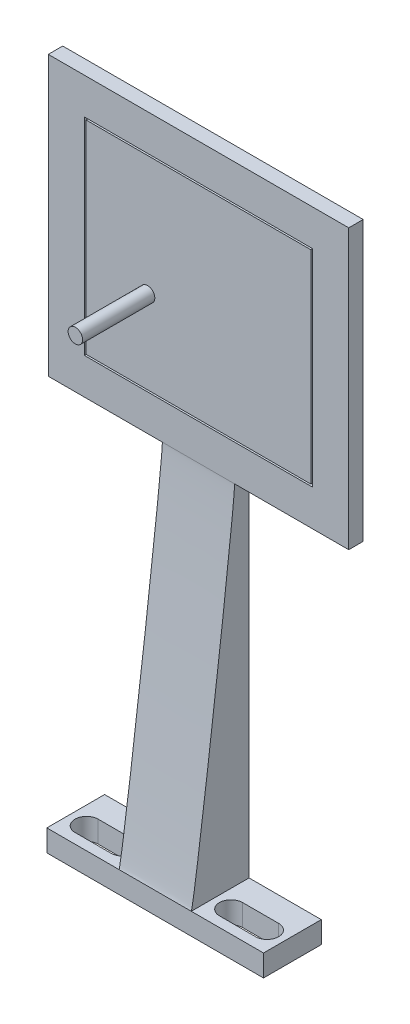
ISO-10303-21;
HEADER;
FILE_DESCRIPTION(('STEP AP214'),'2;1');
FILE_NAME('part.step','',(''),(''),'','','');
FILE_SCHEMA(('AUTOMOTIVE_DESIGN { 1 0 10303 214 1 1 1 1 }'));
ENDSEC;
DATA;
#1=APPLICATION_CONTEXT('core data for automotive mechanical design processes');
#2=APPLICATION_PROTOCOL_DEFINITION('international standard','automotive_design',2000,#1);
#3=PRODUCT_CONTEXT('',#1,'mechanical');
#4=PRODUCT('Part','Part','',(#3));
#5=PRODUCT_RELATED_PRODUCT_CATEGORY('part','',(#4));
#6=PRODUCT_DEFINITION_FORMATION('','',#4);
#7=PRODUCT_DEFINITION_CONTEXT('part definition',#1,'design');
#8=PRODUCT_DEFINITION('design','',#6,#7);
#9=PRODUCT_DEFINITION_SHAPE('','',#8);
#10=(LENGTH_UNIT() NAMED_UNIT(*) SI_UNIT(.MILLI.,.METRE.));
#11=(NAMED_UNIT(*) PLANE_ANGLE_UNIT() SI_UNIT($,.RADIAN.));
#12=(NAMED_UNIT(*) SI_UNIT($,.STERADIAN.) SOLID_ANGLE_UNIT());
#13=UNCERTAINTY_MEASURE_WITH_UNIT(LENGTH_MEASURE(1.E-05),#10,'distance_accuracy_value','');
#14=(GEOMETRIC_REPRESENTATION_CONTEXT(3) GLOBAL_UNCERTAINTY_ASSIGNED_CONTEXT((#13)) GLOBAL_UNIT_ASSIGNED_CONTEXT((#10,
#11,#12)) REPRESENTATION_CONTEXT('',''));
#15=CARTESIAN_POINT('',(0.,0.,0.));
#16=DIRECTION('',(0.,0.,1.));
#17=DIRECTION('',(1.,0.,0.));
#18=AXIS2_PLACEMENT_3D('',#15,#16,#17);
#19=CARTESIAN_POINT('',(0.,-81.6,0.));
#20=DIRECTION('',(0.,-1.,0.));
#21=DIRECTION('',(0.,0.,-1.));
#22=AXIS2_PLACEMENT_3D('',#19,#20,#21);
#23=PLANE('',#22);
#24=DIRECTION('',(-1.,0.,0.));
#25=VECTOR('',#24,1.);
#26=CARTESIAN_POINT('',(0.,-81.6,2.9));
#27=LINE('',#26,#25);
#28=CARTESIAN_POINT('',(8.05000000000001,-81.6,2.9));
#29=VERTEX_POINT('',#28);
#30=CARTESIAN_POINT('',(3.05000000000001,-81.6,2.9));
#31=VERTEX_POINT('',#30);
#32=EDGE_CURVE('E637',#29,#31,#27,.T.);
#33=ORIENTED_EDGE('',*,*,#32,.F.);
#34=CARTESIAN_POINT('',(8.05000000000001,-81.6,4.5));
#35=DIRECTION('',(0.,-1.,0.));
#36=DIRECTION('',(0.,0.,-1.));
#37=AXIS2_PLACEMENT_3D('',#34,#35,#36);
#38=CIRCLE('',#37,1.6);
#39=CARTESIAN_POINT('',(8.05000000000001,-81.6,6.1));
#40=VERTEX_POINT('',#39);
#41=EDGE_CURVE('E264',#40,#29,#38,.F.);
#42=ORIENTED_EDGE('',*,*,#41,.F.);
#43=DIRECTION('',(1.,0.,0.));
#44=VECTOR('',#43,1.);
#45=CARTESIAN_POINT('',(0.,-81.6,6.1));
#46=LINE('',#45,#44);
#47=CARTESIAN_POINT('',(3.0500000570488,-81.6,6.1));
#48=VERTEX_POINT('',#47);
#49=EDGE_CURVE('E547',#48,#40,#46,.T.);
#50=ORIENTED_EDGE('',*,*,#49,.F.);
#51=CARTESIAN_POINT('',(3.05000000000001,-81.6,4.5));
#52=DIRECTION('',(0.,-1.,0.));
#53=DIRECTION('',(0.,0.,-1.));
#54=AXIS2_PLACEMENT_3D('',#51,#52,#53);
#55=CIRCLE('',#54,1.6);
#56=EDGE_CURVE('E550',#48,#31,#55,.T.);
#57=ORIENTED_EDGE('',*,*,#56,.T.);
#58=EDGE_LOOP('',(#33,#42,#50,#57));
#59=FACE_BOUND('',#58,.T.);
#60=DIRECTION('',(1.,0.,0.));
#61=VECTOR('',#60,1.);
#62=CARTESIAN_POINT('',(0.,-81.6,7.5));
#63=LINE('',#62,#61);
#64=CARTESIAN_POINT('',(0.550000000000006,-81.6,7.5));
#65=VERTEX_POINT('',#64);
#66=CARTESIAN_POINT('',(10.55,-81.6,7.5));
#67=VERTEX_POINT('',#66);
#68=EDGE_CURVE('E335',#65,#67,#63,.T.);
#69=ORIENTED_EDGE('',*,*,#68,.T.);
#70=DIRECTION('',(0.,0.,-1.));
#71=VECTOR('',#70,1.);
#72=CARTESIAN_POINT('',(10.55,-81.6,1.5));
#73=LINE('',#72,#71);
#74=CARTESIAN_POINT('',(10.55,-81.6,-0.5));
#75=VERTEX_POINT('',#74);
#76=EDGE_CURVE('E111',#67,#75,#73,.T.);
#77=ORIENTED_EDGE('',*,*,#76,.T.);
#78=DIRECTION('',(1.,0.,0.));
#79=VECTOR('',#78,1.);
#80=CARTESIAN_POINT('',(0.,-81.6,-0.5));
#81=LINE('',#80,#79);
#82=CARTESIAN_POINT('',(0.550000000000007,-81.6,-0.5));
#83=VERTEX_POINT('',#82);
#84=EDGE_CURVE('E319',#83,#75,#81,.T.);
#85=ORIENTED_EDGE('',*,*,#84,.F.);
#86=DIRECTION('',(0.,0.,-1.));
#87=VECTOR('',#86,1.);
#88=CARTESIAN_POINT('',(0.550000000000007,-81.6,0.));
#89=LINE('',#88,#87);
#90=EDGE_CURVE('E329',#65,#83,#89,.T.);
#91=ORIENTED_EDGE('',*,*,#90,.F.);
#92=EDGE_LOOP('',(#69,#77,#85,#91));
#93=FACE_BOUND('',#92,.T.);
#94=ADVANCED_FACE('F83',(#59,#93),#23,.F.);
#95=CARTESIAN_POINT('',(0.,-33.35,-0.5));
#96=DIRECTION('',(0.,-1.,0.));
#97=DIRECTION('',(0.,0.,-1.));
#98=AXIS2_PLACEMENT_3D('',#95,#96,#97);
#99=PLANE('',#98);
#100=DIRECTION('',(0.,0.,-1.));
#101=VECTOR('',#100,1.);
#102=CARTESIAN_POINT('',(10.55,-33.35,1.5));
#103=LINE('',#102,#101);
#104=CARTESIAN_POINT('',(10.55,-33.35,1.5));
#105=VERTEX_POINT('',#104);
#106=CARTESIAN_POINT('',(10.55,-33.35,-0.5));
#107=VERTEX_POINT('',#106);
#108=EDGE_CURVE('E401',#105,#107,#103,.T.);
#109=ORIENTED_EDGE('',*,*,#108,.F.);
#110=DIRECTION('',(1.,0.,0.));
#111=VECTOR('',#110,1.);
#112=CARTESIAN_POINT('',(0.,-33.35,1.5));
#113=LINE('',#112,#111);
#114=CARTESIAN_POINT('',(-5.25,-33.35,1.5));
#115=VERTEX_POINT('',#114);
#116=EDGE_CURVE('E385',#115,#105,#113,.T.);
#117=ORIENTED_EDGE('',*,*,#116,.F.);
#118=DIRECTION('',(0.,0.,1.));
#119=VECTOR('',#118,1.);
#120=CARTESIAN_POINT('',(-5.25,-33.35,-0.5));
#121=LINE('',#120,#119);
#122=CARTESIAN_POINT('',(-5.25,-33.35,-0.5));
#123=VERTEX_POINT('',#122);
#124=EDGE_CURVE('E348',#123,#115,#121,.T.);
#125=ORIENTED_EDGE('',*,*,#124,.F.);
#126=DIRECTION('',(1.,0.,0.));
#127=VECTOR('',#126,1.);
#128=CARTESIAN_POINT('',(0.,-33.35,-0.5));
#129=LINE('',#128,#127);
#130=EDGE_CURVE('E503',#123,#107,#129,.T.);
#131=ORIENTED_EDGE('',*,*,#130,.T.);
#132=EDGE_LOOP('',(#109,#117,#125,#131));
#133=FACE_BOUND('',#132,.T.);
#134=ADVANCED_FACE('F539',(#133),#99,.T.);
#135=CARTESIAN_POINT('',(0.,0.25,-0.5));
#136=DIRECTION('',(0.,-1.,0.));
#137=DIRECTION('',(0.,0.,-1.));
#138=AXIS2_PLACEMENT_3D('',#135,#136,#137);
#139=PLANE('',#138);
#140=DIRECTION('',(1.,0.,0.));
#141=VECTOR('',#140,1.);
#142=CARTESIAN_POINT('',(0.,0.25,1.5));
#143=LINE('',#142,#141);
#144=CARTESIAN_POINT('',(-0.25,0.25,1.5));
#145=VERTEX_POINT('',#144);
#146=CARTESIAN_POINT('',(31.35,0.25,1.5));
#147=VERTEX_POINT('',#146);
#148=EDGE_CURVE('E381',#145,#147,#143,.T.);
#149=ORIENTED_EDGE('',*,*,#148,.F.);
#150=DIRECTION('',(0.,0.,1.));
#151=VECTOR('',#150,1.);
#152=CARTESIAN_POINT('',(-0.25,0.25,-0.5));
#153=LINE('',#152,#151);
#154=CARTESIAN_POINT('',(-0.25,0.25,-0.5));
#155=VERTEX_POINT('',#154);
#156=EDGE_CURVE('E365',#155,#145,#153,.T.);
#157=ORIENTED_EDGE('',*,*,#156,.F.);
#158=DIRECTION('',(1.,0.,0.));
#159=VECTOR('',#158,1.);
#160=CARTESIAN_POINT('',(0.,0.25,-0.5));
#161=LINE('',#160,#159);
#162=CARTESIAN_POINT('',(31.35,0.25,-0.5));
#163=VERTEX_POINT('',#162);
#164=EDGE_CURVE('E506',#155,#163,#161,.T.);
#165=ORIENTED_EDGE('',*,*,#164,.T.);
#166=DIRECTION('',(0.,0.,1.));
#167=VECTOR('',#166,1.);
#168=CARTESIAN_POINT('',(31.35,0.25,-0.5));
#169=LINE('',#168,#167);
#170=EDGE_CURVE('E355',#163,#147,#169,.T.);
#171=ORIENTED_EDGE('',*,*,#170,.T.);
#172=EDGE_LOOP('',(#149,#157,#165,#171));
#173=FACE_BOUND('',#172,.T.);
#174=ADVANCED_FACE('F714',(#173),#139,.T.);
#175=CARTESIAN_POINT('',(-0.25,0.,-0.5));
#176=DIRECTION('',(-1.,0.,0.));
#177=DIRECTION('',(0.,-1.,0.));
#178=AXIS2_PLACEMENT_3D('',#175,#176,#177);
#179=PLANE('',#178);
#180=DIRECTION('',(0.,-1.,0.));
#181=VECTOR('',#180,1.);
#182=CARTESIAN_POINT('',(-0.25,0.,1.5));
#183=LINE('',#182,#181);
#184=CARTESIAN_POINT('',(-0.249999999999996,-28.35,1.5));
#185=VERTEX_POINT('',#184);
#186=EDGE_CURVE('E368',#145,#185,#183,.T.);
#187=ORIENTED_EDGE('',*,*,#186,.T.);
#188=DIRECTION('',(0.,0.,1.));
#189=VECTOR('',#188,1.);
#190=CARTESIAN_POINT('',(-0.249999999999996,-28.35,-0.5));
#191=LINE('',#190,#189);
#192=CARTESIAN_POINT('',(-0.249999999999996,-28.35,-0.5));
#193=VERTEX_POINT('',#192);
#194=EDGE_CURVE('E361',#193,#185,#191,.T.);
#195=ORIENTED_EDGE('',*,*,#194,.F.);
#196=DIRECTION('',(0.,-1.,0.));
#197=VECTOR('',#196,1.);
#198=CARTESIAN_POINT('',(-0.25,0.,-0.5));
#199=LINE('',#198,#197);
#200=EDGE_CURVE('E345',#155,#193,#199,.T.);
#201=ORIENTED_EDGE('',*,*,#200,.F.);
#202=ORIENTED_EDGE('',*,*,#156,.T.);
#203=EDGE_LOOP('',(#187,#195,#201,#202));
#204=FACE_BOUND('',#203,.T.);
#205=ADVANCED_FACE('F433',(#204),#179,.F.);
#206=CARTESIAN_POINT('',(0.,-28.35,-0.5));
#207=DIRECTION('',(0.,-1.,0.));
#208=DIRECTION('',(0.,0.,-1.));
#209=AXIS2_PLACEMENT_3D('',#206,#207,#208);
#210=PLANE('',#209);
#211=DIRECTION('',(1.,0.,0.));
#212=VECTOR('',#211,1.);
#213=CARTESIAN_POINT('',(0.,-28.35,1.5));
#214=LINE('',#213,#212);
#215=CARTESIAN_POINT('',(31.35,-28.35,1.5));
#216=VERTEX_POINT('',#215);
#217=EDGE_CURVE('E373',#185,#216,#214,.T.);
#218=ORIENTED_EDGE('',*,*,#217,.T.);
#219=DIRECTION('',(0.,0.,1.));
#220=VECTOR('',#219,1.);
#221=CARTESIAN_POINT('',(31.35,-28.35,-0.5));
#222=LINE('',#221,#220);
#223=CARTESIAN_POINT('',(31.35,-28.35,-0.5));
#224=VERTEX_POINT('',#223);
#225=EDGE_CURVE('E358',#224,#216,#222,.T.);
#226=ORIENTED_EDGE('',*,*,#225,.F.);
#227=DIRECTION('',(1.,0.,0.));
#228=VECTOR('',#227,1.);
#229=CARTESIAN_POINT('',(0.,-28.35,-0.5));
#230=LINE('',#229,#228);
#231=EDGE_CURVE('E513',#193,#224,#230,.T.);
#232=ORIENTED_EDGE('',*,*,#231,.F.);
#233=ORIENTED_EDGE('',*,*,#194,.T.);
#234=EDGE_LOOP('',(#218,#226,#232,#233));
#235=FACE_BOUND('',#234,.T.);
#236=ADVANCED_FACE('F833',(#235),#210,.F.);
#237=CARTESIAN_POINT('',(36.35,0.,-0.5));
#238=DIRECTION('',(-1.,0.,0.));
#239=DIRECTION('',(0.,-1.,0.));
#240=AXIS2_PLACEMENT_3D('',#237,#238,#239);
#241=PLANE('',#240);
#242=DIRECTION('',(0.,-1.,0.));
#243=VECTOR('',#242,1.);
#244=CARTESIAN_POINT('',(36.35,0.,1.5));
#245=LINE('',#244,#243);
#246=CARTESIAN_POINT('',(36.35,5.25,1.5));
#247=VERTEX_POINT('',#246);
#248=CARTESIAN_POINT('',(36.35,-33.35,1.5));
#249=VERTEX_POINT('',#248);
#250=EDGE_CURVE('E492',#247,#249,#245,.T.);
#251=ORIENTED_EDGE('',*,*,#250,.T.);
#252=DIRECTION('',(0.,0.,1.));
#253=VECTOR('',#252,1.);
#254=CARTESIAN_POINT('',(36.35,-33.35,-0.5));
#255=LINE('',#254,#253);
#256=CARTESIAN_POINT('',(36.35,-33.35,-0.5));
#257=VERTEX_POINT('',#256);
#258=EDGE_CURVE('E351',#257,#249,#255,.T.);
#259=ORIENTED_EDGE('',*,*,#258,.F.);
#260=DIRECTION('',(0.,-1.,0.));
#261=VECTOR('',#260,1.);
#262=CARTESIAN_POINT('',(36.35,0.,-0.5));
#263=LINE('',#262,#261);
#264=CARTESIAN_POINT('',(36.35,5.25,-0.5));
#265=VERTEX_POINT('',#264);
#266=EDGE_CURVE('E372',#265,#257,#263,.T.);
#267=ORIENTED_EDGE('',*,*,#266,.F.);
#268=DIRECTION('',(0.,0.,1.));
#269=VECTOR('',#268,1.);
#270=CARTESIAN_POINT('',(36.35,5.25,-0.5));
#271=LINE('',#270,#269);
#272=EDGE_CURVE('E340',#265,#247,#271,.T.);
#273=ORIENTED_EDGE('',*,*,#272,.T.);
#274=EDGE_LOOP('',(#251,#259,#267,#273));
#275=FACE_BOUND('',#274,.T.);
#276=ADVANCED_FACE('F652',(#275),#241,.F.);
#277=DIRECTION('',(0.,0.,1.));
#278=VECTOR('',#277,1.);
#279=CARTESIAN_POINT('',(20.55,-33.35,1.5));
#280=LINE('',#279,#278);
#281=CARTESIAN_POINT('',(20.55,-33.35,-0.5));
#282=VERTEX_POINT('',#281);
#283=CARTESIAN_POINT('',(20.55,-33.35,1.5));
#284=VERTEX_POINT('',#283);
#285=EDGE_CURVE('E397',#282,#284,#280,.T.);
#286=ORIENTED_EDGE('',*,*,#285,.F.);
#287=EDGE_CURVE('E502',#282,#257,#129,.T.);
#288=ORIENTED_EDGE('',*,*,#287,.T.);
#289=ORIENTED_EDGE('',*,*,#258,.T.);
#290=EDGE_CURVE('E394',#284,#249,#113,.T.);
#291=ORIENTED_EDGE('',*,*,#290,.F.);
#292=EDGE_LOOP('',(#286,#288,#289,#291));
#293=FACE_BOUND('',#292,.T.);
#294=ADVANCED_FACE('F645',(#293),#99,.T.);
#295=CARTESIAN_POINT('',(-5.25,0.,-0.5));
#296=DIRECTION('',(-1.,0.,0.));
#297=DIRECTION('',(0.,-1.,0.));
#298=AXIS2_PLACEMENT_3D('',#295,#296,#297);
#299=PLANE('',#298);
#300=DIRECTION('',(0.,-1.,0.));
#301=VECTOR('',#300,1.);
#302=CARTESIAN_POINT('',(-5.25,0.,1.5));
#303=LINE('',#302,#301);
#304=CARTESIAN_POINT('',(-5.25,5.25,1.5));
#305=VERTEX_POINT('',#304);
#306=EDGE_CURVE('E388',#305,#115,#303,.T.);
#307=ORIENTED_EDGE('',*,*,#306,.F.);
#308=DIRECTION('',(0.,0.,1.));
#309=VECTOR('',#308,1.);
#310=CARTESIAN_POINT('',(-5.25,5.25,-0.5));
#311=LINE('',#310,#309);
#312=CARTESIAN_POINT('',(-5.25,5.25,-0.5));
#313=VERTEX_POINT('',#312);
#314=EDGE_CURVE('E344',#313,#305,#311,.T.);
#315=ORIENTED_EDGE('',*,*,#314,.F.);
#316=DIRECTION('',(0.,-1.,0.));
#317=VECTOR('',#316,1.);
#318=CARTESIAN_POINT('',(-5.25,0.,-0.5));
#319=LINE('',#318,#317);
#320=EDGE_CURVE('E498',#313,#123,#319,.T.);
#321=ORIENTED_EDGE('',*,*,#320,.T.);
#322=ORIENTED_EDGE('',*,*,#124,.T.);
#323=EDGE_LOOP('',(#307,#315,#321,#322));
#324=FACE_BOUND('',#323,.T.);
#325=ADVANCED_FACE('F814',(#324),#299,.T.);
#326=CARTESIAN_POINT('',(0.,5.25,-0.5));
#327=DIRECTION('',(0.,-1.,0.));
#328=DIRECTION('',(0.,0.,-1.));
#329=AXIS2_PLACEMENT_3D('',#326,#327,#328);
#330=PLANE('',#329);
#331=DIRECTION('',(1.,0.,0.));
#332=VECTOR('',#331,1.);
#333=CARTESIAN_POINT('',(0.,5.25,1.5));
#334=LINE('',#333,#332);
#335=EDGE_CURVE('E521',#305,#247,#334,.T.);
#336=ORIENTED_EDGE('',*,*,#335,.T.);
#337=ORIENTED_EDGE('',*,*,#272,.F.);
#338=DIRECTION('',(1.,0.,0.));
#339=VECTOR('',#338,1.);
#340=CARTESIAN_POINT('',(0.,5.25,-0.5));
#341=LINE('',#340,#339);
#342=EDGE_CURVE('E495',#313,#265,#341,.T.);
#343=ORIENTED_EDGE('',*,*,#342,.F.);
#344=ORIENTED_EDGE('',*,*,#314,.T.);
#345=EDGE_LOOP('',(#336,#337,#343,#344));
#346=FACE_BOUND('',#345,.T.);
#347=ADVANCED_FACE('F803',(#346),#330,.F.);
#348=CARTESIAN_POINT('',(31.35,0.,-0.5));
#349=DIRECTION('',(-1.,0.,0.));
#350=DIRECTION('',(0.,-1.,0.));
#351=AXIS2_PLACEMENT_3D('',#348,#349,#350);
#352=PLANE('',#351);
#353=DIRECTION('',(0.,-1.,0.));
#354=VECTOR('',#353,1.);
#355=CARTESIAN_POINT('',(31.35,0.,1.5));
#356=LINE('',#355,#354);
#357=EDGE_CURVE('E377',#147,#216,#356,.T.);
#358=ORIENTED_EDGE('',*,*,#357,.F.);
#359=ORIENTED_EDGE('',*,*,#170,.F.);
#360=DIRECTION('',(0.,-1.,0.));
#361=VECTOR('',#360,1.);
#362=CARTESIAN_POINT('',(31.35,0.,-0.5));
#363=LINE('',#362,#361);
#364=EDGE_CURVE('E510',#163,#224,#363,.T.);
#365=ORIENTED_EDGE('',*,*,#364,.T.);
#366=ORIENTED_EDGE('',*,*,#225,.T.);
#367=EDGE_LOOP('',(#358,#359,#365,#366));
#368=FACE_BOUND('',#367,.T.);
#369=ADVANCED_FACE('F428',(#368),#352,.T.);
#370=CARTESIAN_POINT('',(0.,0.,-0.5));
#371=DIRECTION('',(0.,0.,1.));
#372=DIRECTION('',(1.,0.,0.));
#373=AXIS2_PLACEMENT_3D('',#370,#371,#372);
#374=PLANE('',#373);
#375=ORIENTED_EDGE('',*,*,#266,.T.);
#376=ORIENTED_EDGE('',*,*,#287,.F.);
#377=DIRECTION('',(0.,1.,0.));
#378=VECTOR('',#377,1.);
#379=CARTESIAN_POINT('',(20.55,-81.6,-0.5));
#380=LINE('',#379,#378);
#381=CARTESIAN_POINT('',(20.55,-81.6,-0.5));
#382=VERTEX_POINT('',#381);
#383=EDGE_CURVE('E484',#382,#282,#380,.T.);
#384=ORIENTED_EDGE('',*,*,#383,.F.);
#385=CARTESIAN_POINT('',(30.55,-81.6,-0.5));
#386=VERTEX_POINT('',#385);
#387=EDGE_CURVE('E271',#382,#386,#81,.T.);
#388=ORIENTED_EDGE('',*,*,#387,.T.);
#389=DIRECTION('',(0.,1.,0.));
#390=VECTOR('',#389,1.);
#391=CARTESIAN_POINT('',(30.55,-84.6,-0.5));
#392=LINE('',#391,#390);
#393=CARTESIAN_POINT('',(30.55,-84.6,-0.5));
#394=VERTEX_POINT('',#393);
#395=EDGE_CURVE('E267',#394,#386,#392,.T.);
#396=ORIENTED_EDGE('',*,*,#395,.F.);
#397=DIRECTION('',(1.,0.,0.));
#398=VECTOR('',#397,1.);
#399=CARTESIAN_POINT('',(0.,-84.6,-0.5));
#400=LINE('',#399,#398);
#401=CARTESIAN_POINT('',(0.550000000000007,-84.6,-0.5));
#402=VERTEX_POINT('',#401);
#403=EDGE_CURVE('E250',#402,#394,#400,.T.);
#404=ORIENTED_EDGE('',*,*,#403,.F.);
#405=DIRECTION('',(0.,1.,0.));
#406=VECTOR('',#405,1.);
#407=CARTESIAN_POINT('',(0.550000000000007,-84.6,-0.5));
#408=LINE('',#407,#406);
#409=EDGE_CURVE('E318',#402,#83,#408,.T.);
#410=ORIENTED_EDGE('',*,*,#409,.T.);
#411=ORIENTED_EDGE('',*,*,#84,.T.);
#412=DIRECTION('',(0.,1.,0.));
#413=VECTOR('',#412,1.);
#414=CARTESIAN_POINT('',(10.55,-81.6,-0.5));
#415=LINE('',#414,#413);
#416=EDGE_CURVE('E488',#75,#107,#415,.T.);
#417=ORIENTED_EDGE('',*,*,#416,.T.);
#418=ORIENTED_EDGE('',*,*,#130,.F.);
#419=ORIENTED_EDGE('',*,*,#320,.F.);
#420=ORIENTED_EDGE('',*,*,#342,.T.);
#421=EDGE_LOOP('',(#375,#376,#384,#388,#396,#404,#410,#411,#417,#418,#419,#420));
#422=FACE_BOUND('',#421,.T.);
#423=ORIENTED_EDGE('',*,*,#164,.F.);
#424=ORIENTED_EDGE('',*,*,#200,.T.);
#425=ORIENTED_EDGE('',*,*,#231,.T.);
#426=ORIENTED_EDGE('',*,*,#364,.F.);
#427=EDGE_LOOP('',(#423,#424,#425,#426));
#428=FACE_BOUND('',#427,.T.);
#429=ADVANCED_FACE('F269',(#422,#428),#374,.F.);
#430=CARTESIAN_POINT('',(0.,0.,1.5));
#431=DIRECTION('',(0.,0.,1.));
#432=DIRECTION('',(1.,0.,0.));
#433=AXIS2_PLACEMENT_3D('',#430,#431,#432);
#434=PLANE('',#433);
#435=ORIENTED_EDGE('',*,*,#116,.T.);
#436=CARTESIAN_POINT('',(21.05,-33.35,1.5));
#437=CARTESIAN_POINT('',(17.3833333333333,-33.35,1.5));
#438=CARTESIAN_POINT('',(13.7166666666667,-33.35,1.5));
#439=CARTESIAN_POINT('',(10.05,-33.35,1.5));
#440=(BOUNDED_CURVE() B_SPLINE_CURVE(3,(#436,#437,#438,#439),.UNSPECIFIED.,.F.,
.F.) B_SPLINE_CURVE_WITH_KNOTS((4,4),(-0.02105,-0.01005),
.UNSPECIFIED.) CURVE() GEOMETRIC_REPRESENTATION_ITEM() RATIONAL_B_SPLINE_CURVE((1.,1.,1.,1.)) REPRESENTATION_ITEM(''));
#441=EDGE_CURVE('E367',#105,#284,#440,.F.);
#442=ORIENTED_EDGE('',*,*,#441,.T.);
#443=ORIENTED_EDGE('',*,*,#290,.T.);
#444=ORIENTED_EDGE('',*,*,#250,.F.);
#445=ORIENTED_EDGE('',*,*,#335,.F.);
#446=ORIENTED_EDGE('',*,*,#306,.T.);
#447=EDGE_LOOP('',(#435,#442,#443,#444,#445,#446));
#448=FACE_BOUND('',#447,.T.);
#449=ORIENTED_EDGE('',*,*,#148,.T.);
#450=ORIENTED_EDGE('',*,*,#357,.T.);
#451=ORIENTED_EDGE('',*,*,#217,.F.);
#452=ORIENTED_EDGE('',*,*,#186,.F.);
#453=EDGE_LOOP('',(#449,#450,#451,#452));
#454=FACE_BOUND('',#453,.T.);
#455=ADVANCED_FACE('F423',(#448,#454),#434,.T.);
#456=CARTESIAN_POINT('',(10.55,-81.6,1.5));
#457=DIRECTION('',(1.,0.,0.));
#458=DIRECTION('',(0.,0.,-1.));
#459=AXIS2_PLACEMENT_3D('',#456,#457,#458);
#460=PLANE('',#459);
#461=ORIENTED_EDGE('',*,*,#108,.T.);
#462=ORIENTED_EDGE('',*,*,#416,.F.);
#463=ORIENTED_EDGE('',*,*,#76,.F.);
#464=CARTESIAN_POINT('',(10.55,-33.35,1.5));
#465=CARTESIAN_POINT('',(10.55,-81.6,1.5));
#466=CARTESIAN_POINT('',(10.55,-81.6,7.5));
#467=(BOUNDED_CURVE() B_SPLINE_CURVE(2,(#464,#465,#466),.UNSPECIFIED.,.F.,
.F.) B_SPLINE_CURVE_WITH_KNOTS((3,3),(0.,1.),
.UNSPECIFIED.) CURVE() GEOMETRIC_REPRESENTATION_ITEM() RATIONAL_B_SPLINE_CURVE((1.,
0.0526315789473684,1.)) REPRESENTATION_ITEM(''));
#468=EDGE_CURVE('E97',#67,#105,#467,.F.);
#469=ORIENTED_EDGE('',*,*,#468,.T.);
#470=EDGE_LOOP('',(#461,#462,#463,#469));
#471=FACE_BOUND('',#470,.T.);
#472=ADVANCED_FACE('F412',(#471),#460,.F.);
#473=CARTESIAN_POINT('',(20.55,-81.6,1.5));
#474=DIRECTION('',(-1.,0.,0.));
#475=DIRECTION('',(0.,0.,1.));
#476=AXIS2_PLACEMENT_3D('',#473,#474,#475);
#477=PLANE('',#476);
#478=ORIENTED_EDGE('',*,*,#285,.T.);
#479=CARTESIAN_POINT('',(20.55,-81.6,7.5));
#480=CARTESIAN_POINT('',(20.55,-81.6,1.5));
#481=CARTESIAN_POINT('',(20.55,-33.35,1.5));
#482=(BOUNDED_CURVE() B_SPLINE_CURVE(2,(#479,#480,#481),.UNSPECIFIED.,.F.,
.F.) B_SPLINE_CURVE_WITH_KNOTS((3,3),(0.,1.),
.UNSPECIFIED.) CURVE() GEOMETRIC_REPRESENTATION_ITEM() RATIONAL_B_SPLINE_CURVE((1.,
0.0526315789473684,1.)) REPRESENTATION_ITEM(''));
#483=CARTESIAN_POINT('',(20.55,-81.6,7.5));
#484=VERTEX_POINT('',#483);
#485=EDGE_CURVE('E14',#284,#484,#482,.F.);
#486=ORIENTED_EDGE('',*,*,#485,.T.);
#487=DIRECTION('',(0.,0.,1.));
#488=VECTOR('',#487,1.);
#489=CARTESIAN_POINT('',(20.55,-81.6,1.5));
#490=LINE('',#489,#488);
#491=EDGE_CURVE('E104',#382,#484,#490,.T.);
#492=ORIENTED_EDGE('',*,*,#491,.F.);
#493=ORIENTED_EDGE('',*,*,#383,.T.);
#494=EDGE_LOOP('',(#478,#486,#492,#493));
#495=FACE_BOUND('',#494,.T.);
#496=ADVANCED_FACE('F422',(#495),#477,.F.);
#497=DIRECTION('',(-1.,0.,0.));
#498=VECTOR('',#497,1.);
#499=CARTESIAN_POINT('',(0.,-81.6,2.9));
#500=LINE('',#499,#498);
#501=CARTESIAN_POINT('',(28.05,-81.6,2.9));
#502=VERTEX_POINT('',#501);
#503=CARTESIAN_POINT('',(23.05,-81.6,2.9));
#504=VERTEX_POINT('',#503);
#505=EDGE_CURVE('E558',#502,#504,#500,.T.);
#506=ORIENTED_EDGE('',*,*,#505,.F.);
#507=CARTESIAN_POINT('',(28.05,-81.6,4.5));
#508=DIRECTION('',(0.,-1.,0.));
#509=DIRECTION('',(0.,0.,-1.));
#510=AXIS2_PLACEMENT_3D('',#507,#508,#509);
#511=CIRCLE('',#510,1.6);
#512=CARTESIAN_POINT('',(28.05,-81.6,6.1));
#513=VERTEX_POINT('',#512);
#514=EDGE_CURVE('E630',#513,#502,#511,.F.);
#515=ORIENTED_EDGE('',*,*,#514,.F.);
#516=DIRECTION('',(1.,0.,0.));
#517=VECTOR('',#516,1.);
#518=CARTESIAN_POINT('',(0.,-81.6,6.1));
#519=LINE('',#518,#517);
#520=CARTESIAN_POINT('',(23.05,-81.6,6.1));
#521=VERTEX_POINT('',#520);
#522=EDGE_CURVE('E557',#521,#513,#519,.T.);
#523=ORIENTED_EDGE('',*,*,#522,.F.);
#524=CARTESIAN_POINT('',(23.05,-81.6,4.5));
#525=DIRECTION('',(0.,-1.,0.));
#526=DIRECTION('',(0.,0.,-1.));
#527=AXIS2_PLACEMENT_3D('',#524,#525,#526);
#528=CIRCLE('',#527,1.6);
#529=EDGE_CURVE('E554',#521,#504,#528,.T.);
#530=ORIENTED_EDGE('',*,*,#529,.T.);
#531=EDGE_LOOP('',(#506,#515,#523,#530));
#532=FACE_BOUND('',#531,.T.);
#533=ORIENTED_EDGE('',*,*,#491,.T.);
#534=CARTESIAN_POINT('',(30.55,-81.6,7.5));
#535=VERTEX_POINT('',#534);
#536=EDGE_CURVE('E326',#484,#535,#63,.T.);
#537=ORIENTED_EDGE('',*,*,#536,.T.);
#538=DIRECTION('',(0.,0.,-1.));
#539=VECTOR('',#538,1.);
#540=CARTESIAN_POINT('',(30.55,-81.6,0.));
#541=LINE('',#540,#539);
#542=EDGE_CURVE('E323',#535,#386,#541,.T.);
#543=ORIENTED_EDGE('',*,*,#542,.T.);
#544=ORIENTED_EDGE('',*,*,#387,.F.);
#545=EDGE_LOOP('',(#533,#537,#543,#544));
#546=FACE_BOUND('',#545,.T.);
#547=ADVANCED_FACE('F711',(#532,#546),#23,.F.);
#548=CARTESIAN_POINT('',(0.,-84.6,2.9));
#549=DIRECTION('',(0.,0.,-1.));
#550=DIRECTION('',(-1.,0.,0.));
#551=AXIS2_PLACEMENT_3D('',#548,#549,#550);
#552=PLANE('',#551);
#553=ORIENTED_EDGE('',*,*,#32,.T.);
#554=DIRECTION('',(0.,1.,0.));
#555=VECTOR('',#554,1.);
#556=CARTESIAN_POINT('',(3.05000000000001,-84.6,2.9));
#557=LINE('',#556,#555);
#558=CARTESIAN_POINT('',(3.05000000000001,-84.6,2.9));
#559=VERTEX_POINT('',#558);
#560=EDGE_CURVE('E445',#559,#31,#557,.T.);
#561=ORIENTED_EDGE('',*,*,#560,.F.);
#562=DIRECTION('',(-1.,0.,0.));
#563=VECTOR('',#562,1.);
#564=CARTESIAN_POINT('',(0.,-84.6,2.9));
#565=LINE('',#564,#563);
#566=CARTESIAN_POINT('',(8.05000000000001,-84.6,2.9));
#567=VERTEX_POINT('',#566);
#568=EDGE_CURVE('E305',#567,#559,#565,.T.);
#569=ORIENTED_EDGE('',*,*,#568,.F.);
#570=DIRECTION('',(0.,1.,0.));
#571=VECTOR('',#570,1.);
#572=CARTESIAN_POINT('',(8.05000000000001,-84.6,2.9));
#573=LINE('',#572,#571);
#574=EDGE_CURVE('E476',#567,#29,#573,.T.);
#575=ORIENTED_EDGE('',*,*,#574,.T.);
#576=EDGE_LOOP('',(#553,#561,#569,#575));
#577=FACE_BOUND('',#576,.T.);
#578=ADVANCED_FACE('F721',(#577),#552,.F.);
#579=CARTESIAN_POINT('',(3.05000000000001,-84.6,4.5));
#580=DIRECTION('',(0.,1.,0.));
#581=DIRECTION('',(0.,0.,1.));
#582=AXIS2_PLACEMENT_3D('',#579,#580,#581);
#583=CYLINDRICAL_SURFACE('',#582,1.6);
#584=ORIENTED_EDGE('',*,*,#56,.F.);
#585=DIRECTION('',(0.,1.,0.));
#586=VECTOR('',#585,1.);
#587=CARTESIAN_POINT('',(3.0500000570488,-84.6,6.1));
#588=LINE('',#587,#586);
#589=CARTESIAN_POINT('',(3.0500000570488,-84.6,6.1));
#590=VERTEX_POINT('',#589);
#591=EDGE_CURVE('E450',#590,#48,#588,.T.);
#592=ORIENTED_EDGE('',*,*,#591,.F.);
#593=CARTESIAN_POINT('',(3.05000000000001,-84.6,4.5));
#594=DIRECTION('',(0.,-1.,0.));
#595=DIRECTION('',(0.,0.,-1.));
#596=AXIS2_PLACEMENT_3D('',#593,#594,#595);
#597=CIRCLE('',#596,1.6);
#598=EDGE_CURVE('E308',#590,#559,#597,.T.);
#599=ORIENTED_EDGE('',*,*,#598,.T.);
#600=ORIENTED_EDGE('',*,*,#560,.T.);
#601=EDGE_LOOP('',(#584,#592,#599,#600));
#602=FACE_BOUND('',#601,.T.);
#603=ADVANCED_FACE('F726',(#602),#583,.F.);
#604=CARTESIAN_POINT('',(0.,-84.6,6.1));
#605=DIRECTION('',(0.,0.,1.));
#606=DIRECTION('',(1.,0.,0.));
#607=AXIS2_PLACEMENT_3D('',#604,#605,#606);
#608=PLANE('',#607);
#609=ORIENTED_EDGE('',*,*,#49,.T.);
#610=DIRECTION('',(0.,1.,0.));
#611=VECTOR('',#610,1.);
#612=CARTESIAN_POINT('',(8.05000000000001,-84.6,6.1));
#613=LINE('',#612,#611);
#614=CARTESIAN_POINT('',(8.05000000000001,-84.6,6.1));
#615=VERTEX_POINT('',#614);
#616=EDGE_CURVE('E460',#615,#40,#613,.T.);
#617=ORIENTED_EDGE('',*,*,#616,.F.);
#618=DIRECTION('',(1.,0.,0.));
#619=VECTOR('',#618,1.);
#620=CARTESIAN_POINT('',(0.,-84.6,6.1));
#621=LINE('',#620,#619);
#622=EDGE_CURVE('E312',#590,#615,#621,.T.);
#623=ORIENTED_EDGE('',*,*,#622,.F.);
#624=ORIENTED_EDGE('',*,*,#591,.T.);
#625=EDGE_LOOP('',(#609,#617,#623,#624));
#626=FACE_BOUND('',#625,.T.);
#627=ADVANCED_FACE('F756',(#626),#608,.F.);
#628=CARTESIAN_POINT('',(0.,-84.6,2.9));
#629=DIRECTION('',(0.,0.,-1.));
#630=DIRECTION('',(-1.,0.,0.));
#631=AXIS2_PLACEMENT_3D('',#628,#629,#630);
#632=PLANE('',#631);
#633=ORIENTED_EDGE('',*,*,#505,.T.);
#634=DIRECTION('',(0.,1.,0.));
#635=VECTOR('',#634,1.);
#636=CARTESIAN_POINT('',(23.05,-84.6,2.9));
#637=LINE('',#636,#635);
#638=CARTESIAN_POINT('',(23.05,-84.6,2.9));
#639=VERTEX_POINT('',#638);
#640=EDGE_CURVE('E473',#639,#504,#637,.T.);
#641=ORIENTED_EDGE('',*,*,#640,.F.);
#642=DIRECTION('',(-1.,0.,0.));
#643=VECTOR('',#642,1.);
#644=CARTESIAN_POINT('',(0.,-84.6,2.9));
#645=LINE('',#644,#643);
#646=CARTESIAN_POINT('',(28.05,-84.6,2.9));
#647=VERTEX_POINT('',#646);
#648=EDGE_CURVE('E292',#647,#639,#645,.T.);
#649=ORIENTED_EDGE('',*,*,#648,.F.);
#650=DIRECTION('',(0.,1.,0.));
#651=VECTOR('',#650,1.);
#652=CARTESIAN_POINT('',(28.05,-84.6,2.9));
#653=LINE('',#652,#651);
#654=EDGE_CURVE('E276',#647,#502,#653,.T.);
#655=ORIENTED_EDGE('',*,*,#654,.T.);
#656=EDGE_LOOP('',(#633,#641,#649,#655));
#657=FACE_BOUND('',#656,.T.);
#658=ADVANCED_FACE('F735',(#657),#632,.F.);
#659=CARTESIAN_POINT('',(23.05,-84.6,4.5));
#660=DIRECTION('',(0.,1.,0.));
#661=DIRECTION('',(0.,0.,1.));
#662=AXIS2_PLACEMENT_3D('',#659,#660,#661);
#663=CYLINDRICAL_SURFACE('',#662,1.6);
#664=ORIENTED_EDGE('',*,*,#529,.F.);
#665=DIRECTION('',(0.,1.,0.));
#666=VECTOR('',#665,1.);
#667=CARTESIAN_POINT('',(23.05,-84.6,6.1));
#668=LINE('',#667,#666);
#669=CARTESIAN_POINT('',(23.05,-84.6,6.1));
#670=VERTEX_POINT('',#669);
#671=EDGE_CURVE('E470',#670,#521,#668,.T.);
#672=ORIENTED_EDGE('',*,*,#671,.F.);
#673=CARTESIAN_POINT('',(23.05,-84.6,4.5));
#674=DIRECTION('',(0.,-1.,0.));
#675=DIRECTION('',(0.,0.,-1.));
#676=AXIS2_PLACEMENT_3D('',#673,#674,#675);
#677=CIRCLE('',#676,1.6);
#678=EDGE_CURVE('E295',#670,#639,#677,.T.);
#679=ORIENTED_EDGE('',*,*,#678,.T.);
#680=ORIENTED_EDGE('',*,*,#640,.T.);
#681=EDGE_LOOP('',(#664,#672,#679,#680));
#682=FACE_BOUND('',#681,.T.);
#683=ADVANCED_FACE('F705',(#682),#663,.F.);
#684=CARTESIAN_POINT('',(0.,-84.6,6.1));
#685=DIRECTION('',(0.,0.,1.));
#686=DIRECTION('',(1.,0.,0.));
#687=AXIS2_PLACEMENT_3D('',#684,#685,#686);
#688=PLANE('',#687);
#689=ORIENTED_EDGE('',*,*,#522,.T.);
#690=DIRECTION('',(0.,1.,0.));
#691=VECTOR('',#690,1.);
#692=CARTESIAN_POINT('',(28.05,-84.6,6.1));
#693=LINE('',#692,#691);
#694=CARTESIAN_POINT('',(28.05,-84.6,6.1));
#695=VERTEX_POINT('',#694);
#696=EDGE_CURVE('E466',#695,#513,#693,.T.);
#697=ORIENTED_EDGE('',*,*,#696,.F.);
#698=DIRECTION('',(1.,0.,0.));
#699=VECTOR('',#698,1.);
#700=CARTESIAN_POINT('',(0.,-84.6,6.1));
#701=LINE('',#700,#699);
#702=EDGE_CURVE('E299',#670,#695,#701,.T.);
#703=ORIENTED_EDGE('',*,*,#702,.F.);
#704=ORIENTED_EDGE('',*,*,#671,.T.);
#705=EDGE_LOOP('',(#689,#697,#703,#704));
#706=FACE_BOUND('',#705,.T.);
#707=ADVANCED_FACE('F702',(#706),#688,.F.);
#708=CARTESIAN_POINT('',(30.55,-84.6,0.));
#709=DIRECTION('',(1.,0.,0.));
#710=DIRECTION('',(0.,0.,-1.));
#711=AXIS2_PLACEMENT_3D('',#708,#709,#710);
#712=PLANE('',#711);
#713=ORIENTED_EDGE('',*,*,#542,.F.);
#714=DIRECTION('',(0.,1.,0.));
#715=VECTOR('',#714,1.);
#716=CARTESIAN_POINT('',(30.55,-84.6,7.5));
#717=LINE('',#716,#715);
#718=CARTESIAN_POINT('',(30.55,-84.6,7.5));
#719=VERTEX_POINT('',#718);
#720=EDGE_CURVE('E277',#719,#535,#717,.T.);
#721=ORIENTED_EDGE('',*,*,#720,.F.);
#722=DIRECTION('',(0.,0.,-1.));
#723=VECTOR('',#722,1.);
#724=CARTESIAN_POINT('',(30.55,-84.6,0.));
#725=LINE('',#724,#723);
#726=EDGE_CURVE('E256',#719,#394,#725,.T.);
#727=ORIENTED_EDGE('',*,*,#726,.T.);
#728=ORIENTED_EDGE('',*,*,#395,.T.);
#729=EDGE_LOOP('',(#713,#721,#727,#728));
#730=FACE_BOUND('',#729,.T.);
#731=ADVANCED_FACE('F279',(#730),#712,.T.);
#732=CARTESIAN_POINT('',(0.,-84.6,7.5));
#733=DIRECTION('',(0.,0.,1.));
#734=DIRECTION('',(1.,0.,0.));
#735=AXIS2_PLACEMENT_3D('',#732,#733,#734);
#736=PLANE('',#735);
#737=ORIENTED_EDGE('',*,*,#68,.F.);
#738=DIRECTION('',(0.,1.,0.));
#739=VECTOR('',#738,1.);
#740=CARTESIAN_POINT('',(0.550000000000006,-84.6,7.5));
#741=LINE('',#740,#739);
#742=CARTESIAN_POINT('',(0.550000000000006,-84.6,7.5));
#743=VERTEX_POINT('',#742);
#744=EDGE_CURVE('E479',#743,#65,#741,.T.);
#745=ORIENTED_EDGE('',*,*,#744,.F.);
#746=DIRECTION('',(1.,0.,0.));
#747=VECTOR('',#746,1.);
#748=CARTESIAN_POINT('',(0.,-84.6,7.5));
#749=LINE('',#748,#747);
#750=EDGE_CURVE('E282',#743,#719,#749,.T.);
#751=ORIENTED_EDGE('',*,*,#750,.T.);
#752=ORIENTED_EDGE('',*,*,#720,.T.);
#753=ORIENTED_EDGE('',*,*,#536,.F.);
#754=CARTESIAN_POINT('',(10.05,-81.6,7.5));
#755=CARTESIAN_POINT('',(13.7166666666667,-81.6,7.5));
#756=CARTESIAN_POINT('',(17.3833333333333,-81.6,7.5));
#757=CARTESIAN_POINT('',(21.05,-81.6,7.5));
#758=(BOUNDED_CURVE() B_SPLINE_CURVE(3,(#754,#755,#756,#757),.UNSPECIFIED.,.F.,
.F.) B_SPLINE_CURVE_WITH_KNOTS((4,4),(-0.02105,-0.01005),
.UNSPECIFIED.) CURVE() GEOMETRIC_REPRESENTATION_ITEM() RATIONAL_B_SPLINE_CURVE((1.,1.,1.,1.)) REPRESENTATION_ITEM(''));
#759=EDGE_CURVE('E339',#67,#484,#758,.T.);
#760=ORIENTED_EDGE('',*,*,#759,.F.);
#761=EDGE_LOOP('',(#737,#745,#751,#752,#753,#760));
#762=FACE_BOUND('',#761,.T.);
#763=ADVANCED_FACE('F689',(#762),#736,.T.);
#764=CARTESIAN_POINT('',(28.05,-84.6,4.5));
#765=DIRECTION('',(0.,1.,0.));
#766=DIRECTION('',(0.,0.,1.));
#767=AXIS2_PLACEMENT_3D('',#764,#765,#766);
#768=CYLINDRICAL_SURFACE('',#767,1.6);
#769=ORIENTED_EDGE('',*,*,#514,.T.);
#770=ORIENTED_EDGE('',*,*,#654,.F.);
#771=CARTESIAN_POINT('',(28.05,-84.6,4.5));
#772=DIRECTION('',(0.,-1.,0.));
#773=DIRECTION('',(0.,0.,-1.));
#774=AXIS2_PLACEMENT_3D('',#771,#772,#773);
#775=CIRCLE('',#774,1.6);
#776=EDGE_CURVE('E302',#695,#647,#775,.F.);
#777=ORIENTED_EDGE('',*,*,#776,.F.);
#778=ORIENTED_EDGE('',*,*,#696,.T.);
#779=EDGE_LOOP('',(#769,#770,#777,#778));
#780=FACE_BOUND('',#779,.T.);
#781=ADVANCED_FACE('F698',(#780),#768,.F.);
#782=CARTESIAN_POINT('',(0.550000000000007,-84.6,0.));
#783=DIRECTION('',(1.,0.,0.));
#784=DIRECTION('',(0.,0.,-1.));
#785=AXIS2_PLACEMENT_3D('',#782,#783,#784);
#786=PLANE('',#785);
#787=ORIENTED_EDGE('',*,*,#90,.T.);
#788=ORIENTED_EDGE('',*,*,#409,.F.);
#789=DIRECTION('',(0.,0.,-1.));
#790=VECTOR('',#789,1.);
#791=CARTESIAN_POINT('',(0.550000000000007,-84.6,0.));
#792=LINE('',#791,#790);
#793=EDGE_CURVE('E259',#743,#402,#792,.T.);
#794=ORIENTED_EDGE('',*,*,#793,.F.);
#795=ORIENTED_EDGE('',*,*,#744,.T.);
#796=EDGE_LOOP('',(#787,#788,#794,#795));
#797=FACE_BOUND('',#796,.T.);
#798=ADVANCED_FACE('F699',(#797),#786,.F.);
#799=CARTESIAN_POINT('',(8.05000000000001,-84.6,4.5));
#800=DIRECTION('',(0.,1.,0.));
#801=DIRECTION('',(0.,0.,1.));
#802=AXIS2_PLACEMENT_3D('',#799,#800,#801);
#803=CYLINDRICAL_SURFACE('',#802,1.6);
#804=ORIENTED_EDGE('',*,*,#41,.T.);
#805=ORIENTED_EDGE('',*,*,#574,.F.);
#806=CARTESIAN_POINT('',(8.05000000000001,-84.6,4.5));
#807=DIRECTION('',(0.,-1.,0.));
#808=DIRECTION('',(0.,0.,-1.));
#809=AXIS2_PLACEMENT_3D('',#806,#807,#808);
#810=CIRCLE('',#809,1.6);
#811=EDGE_CURVE('E315',#615,#567,#810,.F.);
#812=ORIENTED_EDGE('',*,*,#811,.F.);
#813=ORIENTED_EDGE('',*,*,#616,.T.);
#814=EDGE_LOOP('',(#804,#805,#812,#813));
#815=FACE_BOUND('',#814,.T.);
#816=ADVANCED_FACE('F746',(#815),#803,.F.);
#817=CARTESIAN_POINT('',(0.,-84.6,0.));
#818=DIRECTION('',(0.,-1.,0.));
#819=DIRECTION('',(0.,0.,-1.));
#820=AXIS2_PLACEMENT_3D('',#817,#818,#819);
#821=PLANE('',#820);
#822=ORIENTED_EDGE('',*,*,#403,.T.);
#823=ORIENTED_EDGE('',*,*,#726,.F.);
#824=ORIENTED_EDGE('',*,*,#750,.F.);
#825=ORIENTED_EDGE('',*,*,#793,.T.);
#826=EDGE_LOOP('',(#822,#823,#824,#825));
#827=FACE_BOUND('',#826,.T.);
#828=ORIENTED_EDGE('',*,*,#648,.T.);
#829=ORIENTED_EDGE('',*,*,#678,.F.);
#830=ORIENTED_EDGE('',*,*,#702,.T.);
#831=ORIENTED_EDGE('',*,*,#776,.T.);
#832=EDGE_LOOP('',(#828,#829,#830,#831));
#833=FACE_BOUND('',#832,.T.);
#834=ORIENTED_EDGE('',*,*,#568,.T.);
#835=ORIENTED_EDGE('',*,*,#598,.F.);
#836=ORIENTED_EDGE('',*,*,#622,.T.);
#837=ORIENTED_EDGE('',*,*,#811,.T.);
#838=EDGE_LOOP('',(#834,#835,#836,#837));
#839=FACE_BOUND('',#838,.T.);
#840=ADVANCED_FACE('F252',(#827,#833,#839),#821,.T.);
#841=CARTESIAN_POINT('',(21.05,-81.6,7.5));
#842=CARTESIAN_POINT('',(17.3833333333333,-81.6,7.5));
#843=CARTESIAN_POINT('',(13.7166666666667,-81.6,7.5));
#844=CARTESIAN_POINT('',(10.05,-81.6,7.5));
#845=CARTESIAN_POINT('',(21.05,-81.6,1.5));
#846=CARTESIAN_POINT('',(17.3833333333333,-81.6,1.5));
#847=CARTESIAN_POINT('',(13.7166666666667,-81.6,1.5));
#848=CARTESIAN_POINT('',(10.05,-81.6,1.5));
#849=CARTESIAN_POINT('',(21.05,-33.35,1.5));
#850=CARTESIAN_POINT('',(17.3833333333333,-33.35,1.5));
#851=CARTESIAN_POINT('',(13.7166666666667,-33.35,1.5));
#852=CARTESIAN_POINT('',(10.05,-33.35,1.5));
#853=(BOUNDED_SURFACE() B_SPLINE_SURFACE(2,3,((#841,#842,#843,#844),(#845,#846,#847,#848),(#849,
#850,#851,#852)),.UNSPECIFIED.,.F.,.F.,.F.) B_SPLINE_SURFACE_WITH_KNOTS((3,3),(4,4),(0.,1.),
(-0.02105,-0.01005),
.UNSPECIFIED.) GEOMETRIC_REPRESENTATION_ITEM() RATIONAL_B_SPLINE_SURFACE(((1.,1.,1.,1.),
(0.0526315789473684,0.0526315789473684,0.0526315789473684,0.0526315789473684),(1.,1.,1.,1.))) REPRESENTATION_ITEM('') SURFACE());
#854=ORIENTED_EDGE('',*,*,#485,.F.);
#855=ORIENTED_EDGE('',*,*,#441,.F.);
#856=ORIENTED_EDGE('',*,*,#468,.F.);
#857=ORIENTED_EDGE('',*,*,#759,.T.);
#858=EDGE_LOOP('',(#854,#855,#856,#857));
#859=FACE_BOUND('',#858,.T.);
#860=ADVANCED_FACE('F86',(#859),#853,.T.);
#861=CLOSED_SHELL('',(#94,#134,#174,#205,#236,#276,#294,#325,#347,#369,#429,#455,#472,#496,#547,
#578,#603,#627,#658,#683,#707,#731,#763,#781,#798,#816,#840,#860));
#862=MANIFOLD_SOLID_BREP('B2',#861);
#863=CARTESIAN_POINT('',(0.,0.,1.5));
#864=DIRECTION('',(1.,0.,0.));
#865=DIRECTION('',(0.,1.,0.));
#866=AXIS2_PLACEMENT_3D('',#863,#864,#865);
#867=PLANE('',#866);
#868=DIRECTION('',(0.,-1.,0.));
#869=VECTOR('',#868,1.);
#870=CARTESIAN_POINT('',(0.,0.,0.));
#871=LINE('',#870,#869);
#872=CARTESIAN_POINT('',(0.,0.,0.));
#873=VERTEX_POINT('',#872);
#874=CARTESIAN_POINT('',(0.,-28.1,0.));
#875=VERTEX_POINT('',#874);
#876=EDGE_CURVE('E1207',#873,#875,#871,.T.);
#877=ORIENTED_EDGE('',*,*,#876,.T.);
#878=DIRECTION('',(0.,0.,-1.));
#879=VECTOR('',#878,1.);
#880=CARTESIAN_POINT('',(0.,-28.1,1.5));
#881=LINE('',#880,#879);
#882=CARTESIAN_POINT('',(0.,-28.1,1.5));
#883=VERTEX_POINT('',#882);
#884=EDGE_CURVE('E1157',#883,#875,#881,.T.);
#885=ORIENTED_EDGE('',*,*,#884,.F.);
#886=DIRECTION('',(0.,-1.,0.));
#887=VECTOR('',#886,1.);
#888=CARTESIAN_POINT('',(0.,0.,1.5));
#889=LINE('',#888,#887);
#890=CARTESIAN_POINT('',(0.,0.,1.5));
#891=VERTEX_POINT('',#890);
#892=EDGE_CURVE('E1199',#891,#883,#889,.T.);
#893=ORIENTED_EDGE('',*,*,#892,.F.);
#894=DIRECTION('',(0.,0.,-1.));
#895=VECTOR('',#894,1.);
#896=CARTESIAN_POINT('',(0.,0.,1.5));
#897=LINE('',#896,#895);
#898=EDGE_CURVE('E81',#891,#873,#897,.T.);
#899=ORIENTED_EDGE('',*,*,#898,.T.);
#900=EDGE_LOOP('',(#877,#885,#893,#899));
#901=FACE_BOUND('',#900,.T.);
#902=ADVANCED_FACE('F1148',(#901),#867,.F.);
#903=CARTESIAN_POINT('',(0.,-28.1,1.5));
#904=DIRECTION('',(0.,1.,0.));
#905=DIRECTION('',(0.,0.,1.));
#906=AXIS2_PLACEMENT_3D('',#903,#904,#905);
#907=PLANE('',#906);
#908=DIRECTION('',(1.,0.,0.));
#909=VECTOR('',#908,1.);
#910=CARTESIAN_POINT('',(0.,-28.1,0.));
#911=LINE('',#910,#909);
#912=CARTESIAN_POINT('',(31.1,-28.1,0.));
#913=VERTEX_POINT('',#912);
#914=EDGE_CURVE('E1214',#875,#913,#911,.T.);
#915=ORIENTED_EDGE('',*,*,#914,.T.);
#916=DIRECTION('',(0.,0.,-1.));
#917=VECTOR('',#916,1.);
#918=CARTESIAN_POINT('',(31.1,-28.1,1.5));
#919=LINE('',#918,#917);
#920=CARTESIAN_POINT('',(31.1,-28.1,1.5));
#921=VERTEX_POINT('',#920);
#922=EDGE_CURVE('E1179',#921,#913,#919,.T.);
#923=ORIENTED_EDGE('',*,*,#922,.F.);
#924=DIRECTION('',(1.,0.,0.));
#925=VECTOR('',#924,1.);
#926=CARTESIAN_POINT('',(0.,-28.1,1.5));
#927=LINE('',#926,#925);
#928=EDGE_CURVE('E1191',#883,#921,#927,.T.);
#929=ORIENTED_EDGE('',*,*,#928,.F.);
#930=ORIENTED_EDGE('',*,*,#884,.T.);
#931=EDGE_LOOP('',(#915,#923,#929,#930));
#932=FACE_BOUND('',#931,.T.);
#933=ADVANCED_FACE('F1193',(#932),#907,.F.);
#934=CARTESIAN_POINT('',(31.1,0.,1.5));
#935=DIRECTION('',(1.,0.,0.));
#936=DIRECTION('',(0.,1.,0.));
#937=AXIS2_PLACEMENT_3D('',#934,#935,#936);
#938=PLANE('',#937);
#939=DIRECTION('',(0.,-1.,0.));
#940=VECTOR('',#939,1.);
#941=CARTESIAN_POINT('',(31.1,0.,0.));
#942=LINE('',#941,#940);
#943=CARTESIAN_POINT('',(31.1,0.,0.));
#944=VERTEX_POINT('',#943);
#945=EDGE_CURVE('E1211',#944,#913,#942,.T.);
#946=ORIENTED_EDGE('',*,*,#945,.F.);
#947=DIRECTION('',(0.,0.,-1.));
#948=VECTOR('',#947,1.);
#949=CARTESIAN_POINT('',(31.1,0.,1.5));
#950=LINE('',#949,#948);
#951=CARTESIAN_POINT('',(31.1,0.,1.5));
#952=VERTEX_POINT('',#951);
#953=EDGE_CURVE('E1165',#952,#944,#950,.T.);
#954=ORIENTED_EDGE('',*,*,#953,.F.);
#955=DIRECTION('',(0.,-1.,0.));
#956=VECTOR('',#955,1.);
#957=CARTESIAN_POINT('',(31.1,0.,1.5));
#958=LINE('',#957,#956);
#959=EDGE_CURVE('E1198',#952,#921,#958,.T.);
#960=ORIENTED_EDGE('',*,*,#959,.T.);
#961=ORIENTED_EDGE('',*,*,#922,.T.);
#962=EDGE_LOOP('',(#946,#954,#960,#961));
#963=FACE_BOUND('',#962,.T.);
#964=ADVANCED_FACE('F1248',(#963),#938,.T.);
#965=CARTESIAN_POINT('',(0.,0.,1.5));
#966=DIRECTION('',(0.,1.,0.));
#967=DIRECTION('',(0.,0.,1.));
#968=AXIS2_PLACEMENT_3D('',#965,#966,#967);
#969=PLANE('',#968);
#970=DIRECTION('',(1.,0.,0.));
#971=VECTOR('',#970,1.);
#972=CARTESIAN_POINT('',(0.,0.,0.));
#973=LINE('',#972,#971);
#974=EDGE_CURVE('E1217',#873,#944,#973,.T.);
#975=ORIENTED_EDGE('',*,*,#974,.F.);
#976=ORIENTED_EDGE('',*,*,#898,.F.);
#977=DIRECTION('',(1.,0.,0.));
#978=VECTOR('',#977,1.);
#979=CARTESIAN_POINT('',(0.,0.,1.5));
#980=LINE('',#979,#978);
#981=EDGE_CURVE('E1203',#891,#952,#980,.T.);
#982=ORIENTED_EDGE('',*,*,#981,.T.);
#983=ORIENTED_EDGE('',*,*,#953,.T.);
#984=EDGE_LOOP('',(#975,#976,#982,#983));
#985=FACE_BOUND('',#984,.T.);
#986=ADVANCED_FACE('F1150',(#985),#969,.T.);
#987=CARTESIAN_POINT('',(0.,0.,0.));
#988=DIRECTION('',(0.,0.,1.));
#989=DIRECTION('',(1.,0.,0.));
#990=AXIS2_PLACEMENT_3D('',#987,#988,#989);
#991=PLANE('',#990);
#992=ORIENTED_EDGE('',*,*,#974,.T.);
#993=ORIENTED_EDGE('',*,*,#945,.T.);
#994=ORIENTED_EDGE('',*,*,#914,.F.);
#995=ORIENTED_EDGE('',*,*,#876,.F.);
#996=EDGE_LOOP('',(#992,#993,#994,#995));
#997=FACE_BOUND('',#996,.T.);
#998=ADVANCED_FACE('F1237',(#997),#991,.F.);
#999=CARTESIAN_POINT('',(0.,0.,1.5));
#1000=DIRECTION('',(0.,0.,1.));
#1001=DIRECTION('',(1.,0.,0.));
#1002=AXIS2_PLACEMENT_3D('',#999,#1000,#1001);
#1003=PLANE('',#1002);
#1004=CARTESIAN_POINT('',(8.5,-16.6,1.5));
#1005=DIRECTION('',(0.,0.,1.));
#1006=DIRECTION('',(1.,0.,0.));
#1007=AXIS2_PLACEMENT_3D('',#1004,#1005,#1006);
#1008=CIRCLE('',#1007,1.);
#1009=CARTESIAN_POINT('',(9.50000000000001,-16.6,1.5));
#1010=VERTEX_POINT('',#1009);
#1011=EDGE_CURVE('E1222',#1010,#1010,#1008,.T.);
#1012=ORIENTED_EDGE('',*,*,#1011,.F.);
#1013=EDGE_LOOP('',(#1012));
#1014=FACE_BOUND('',#1013,.T.);
#1015=ORIENTED_EDGE('',*,*,#981,.F.);
#1016=ORIENTED_EDGE('',*,*,#892,.T.);
#1017=ORIENTED_EDGE('',*,*,#928,.T.);
#1018=ORIENTED_EDGE('',*,*,#959,.F.);
#1019=EDGE_LOOP('',(#1015,#1016,#1017,#1018));
#1020=FACE_BOUND('',#1019,.T.);
#1021=ADVANCED_FACE('F1202',(#1014,#1020),#1003,.T.);
#1022=CARTESIAN_POINT('',(8.5,-16.6,11.5));
#1023=DIRECTION('',(0.,0.,-1.));
#1024=DIRECTION('',(-1.,0.,0.));
#1025=AXIS2_PLACEMENT_3D('',#1022,#1023,#1024);
#1026=CYLINDRICAL_SURFACE('',#1025,1.);
#1027=CARTESIAN_POINT('',(8.5,-16.6,11.5));
#1028=DIRECTION('',(0.,0.,1.));
#1029=DIRECTION('',(1.,0.,0.));
#1030=AXIS2_PLACEMENT_3D('',#1027,#1028,#1029);
#1031=CIRCLE('',#1030,1.);
#1032=CARTESIAN_POINT('',(9.50000000000001,-16.6,11.5));
#1033=VERTEX_POINT('',#1032);
#1034=EDGE_CURVE('E1219',#1033,#1033,#1031,.T.);
#1035=ORIENTED_EDGE('',*,*,#1034,.F.);
#1036=EDGE_LOOP('',(#1035));
#1037=FACE_BOUND('',#1036,.T.);
#1038=ORIENTED_EDGE('',*,*,#1011,.T.);
#1039=EDGE_LOOP('',(#1038));
#1040=FACE_BOUND('',#1039,.T.);
#1041=ADVANCED_FACE('F1230',(#1037,#1040),#1026,.T.);
#1042=CARTESIAN_POINT('',(0.,0.,11.5));
#1043=DIRECTION('',(0.,0.,1.));
#1044=DIRECTION('',(1.,0.,0.));
#1045=AXIS2_PLACEMENT_3D('',#1042,#1043,#1044);
#1046=PLANE('',#1045);
#1047=ORIENTED_EDGE('',*,*,#1034,.T.);
#1048=EDGE_LOOP('',(#1047));
#1049=FACE_BOUND('',#1048,.T.);
#1050=ADVANCED_FACE('F1228',(#1049),#1046,.T.);
#1051=CLOSED_SHELL('',(#902,#933,#964,#986,#998,#1021,#1041,#1050));
#1052=MANIFOLD_SOLID_BREP('B8_NOT_SHOWN',#1051);
#1053=ADVANCED_BREP_SHAPE_REPRESENTATION('',(#18,#862,#1052),#14);
#1054=SHAPE_DEFINITION_REPRESENTATION(#9,#1053);
ENDSEC;
END-ISO-10303-21;
